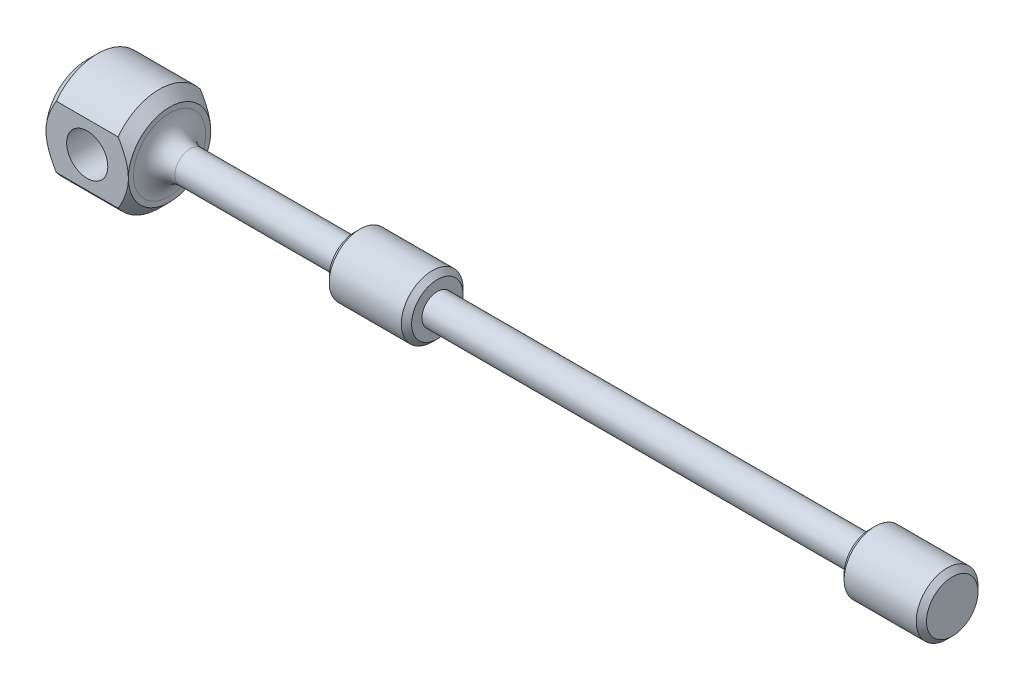
ISO-10303-21;
HEADER;
FILE_DESCRIPTION(('STEP AP214'),'2;1');
FILE_NAME('part.step','',(''),(''),'','','');
FILE_SCHEMA(('AUTOMOTIVE_DESIGN { 1 0 10303 214 1 1 1 1 }'));
ENDSEC;
DATA;
#1=APPLICATION_CONTEXT('core data for automotive mechanical design processes');
#2=APPLICATION_PROTOCOL_DEFINITION('international standard','automotive_design',2000,#1);
#3=PRODUCT_CONTEXT('',#1,'mechanical');
#4=PRODUCT('Part','Part','',(#3));
#5=PRODUCT_RELATED_PRODUCT_CATEGORY('part','',(#4));
#6=PRODUCT_DEFINITION_FORMATION('','',#4);
#7=PRODUCT_DEFINITION_CONTEXT('part definition',#1,'design');
#8=PRODUCT_DEFINITION('design','',#6,#7);
#9=PRODUCT_DEFINITION_SHAPE('','',#8);
#10=(LENGTH_UNIT() NAMED_UNIT(*) SI_UNIT(.MILLI.,.METRE.));
#11=(NAMED_UNIT(*) PLANE_ANGLE_UNIT() SI_UNIT($,.RADIAN.));
#12=(NAMED_UNIT(*) SI_UNIT($,.STERADIAN.) SOLID_ANGLE_UNIT());
#13=UNCERTAINTY_MEASURE_WITH_UNIT(LENGTH_MEASURE(1.E-05),#10,'distance_accuracy_value','');
#14=(GEOMETRIC_REPRESENTATION_CONTEXT(3) GLOBAL_UNCERTAINTY_ASSIGNED_CONTEXT((#13)) GLOBAL_UNIT_ASSIGNED_CONTEXT((#10,
#11,#12)) REPRESENTATION_CONTEXT('',''));
#15=CARTESIAN_POINT('',(0.,0.,0.));
#16=DIRECTION('',(0.,0.,1.));
#17=DIRECTION('',(1.,0.,0.));
#18=AXIS2_PLACEMENT_3D('',#15,#16,#17);
#19=CARTESIAN_POINT('',(-30.,0.,0.));
#20=DIRECTION('',(-1.,0.,0.));
#21=DIRECTION('',(0.,0.,1.));
#22=AXIS2_PLACEMENT_3D('',#19,#20,#21);
#23=CYLINDRICAL_SURFACE('',#22,5.);
#24=DIRECTION('',(-1.,0.,0.));
#25=VECTOR('',#24,1.);
#26=CARTESIAN_POINT('',(-30.,-3.,-4.));
#27=LINE('',#26,#25);
#28=CARTESIAN_POINT('',(-31.,-3.,-4.));
#29=VERTEX_POINT('',#28);
#30=CARTESIAN_POINT('',(-37.,-3.,-4.));
#31=VERTEX_POINT('',#30);
#32=EDGE_CURVE('E195',#29,#31,#27,.T.);
#33=ORIENTED_EDGE('',*,*,#32,.F.);
#34=CARTESIAN_POINT('',(-31.,0.,0.));
#35=DIRECTION('',(-1.,0.,0.));
#36=DIRECTION('',(0.,0.,1.));
#37=AXIS2_PLACEMENT_3D('',#34,#35,#36);
#38=CIRCLE('',#37,5.);
#39=CARTESIAN_POINT('',(-31.,-3.,4.));
#40=VERTEX_POINT('',#39);
#41=EDGE_CURVE('E157',#29,#40,#38,.T.);
#42=ORIENTED_EDGE('',*,*,#41,.T.);
#43=DIRECTION('',(-1.,0.,0.));
#44=VECTOR('',#43,1.);
#45=CARTESIAN_POINT('',(-30.,-3.,4.));
#46=LINE('',#45,#44);
#47=CARTESIAN_POINT('',(-37.,-3.,4.));
#48=VERTEX_POINT('',#47);
#49=EDGE_CURVE('E188',#40,#48,#46,.T.);
#50=ORIENTED_EDGE('',*,*,#49,.T.);
#51=CARTESIAN_POINT('',(-37.,0.,0.));
#52=DIRECTION('',(1.,0.,0.));
#53=DIRECTION('',(0.,0.,-1.));
#54=AXIS2_PLACEMENT_3D('',#51,#52,#53);
#55=CIRCLE('',#54,5.);
#56=EDGE_CURVE('E93',#48,#31,#55,.T.);
#57=ORIENTED_EDGE('',*,*,#56,.T.);
#58=EDGE_LOOP('',(#33,#42,#50,#57));
#59=FACE_BOUND('',#58,.T.);
#60=ADVANCED_FACE('F32',(#59),#23,.T.);
#61=CARTESIAN_POINT('',(38.,0.,0.));
#62=DIRECTION('',(-1.,0.,0.));
#63=DIRECTION('',(0.,0.,1.));
#64=AXIS2_PLACEMENT_3D('',#61,#62,#63);
#65=CYLINDRICAL_SURFACE('',#64,1.5);
#66=CARTESIAN_POINT('',(-28.,0.,0.));
#67=DIRECTION('',(-1.,0.,0.));
#68=DIRECTION('',(0.,0.,1.));
#69=AXIS2_PLACEMENT_3D('',#66,#67,#68);
#70=CIRCLE('',#69,1.5);
#71=CARTESIAN_POINT('',(-28.,0.,1.5));
#72=VERTEX_POINT('',#71);
#73=EDGE_CURVE('E297',#72,#72,#70,.F.);
#74=ORIENTED_EDGE('',*,*,#73,.T.);
#75=EDGE_LOOP('',(#74));
#76=FACE_BOUND('',#75,.T.);
#77=CARTESIAN_POINT('',(-12.,0.,0.));
#78=DIRECTION('',(1.,0.,0.));
#79=DIRECTION('',(0.,0.,-1.));
#80=AXIS2_PLACEMENT_3D('',#77,#78,#79);
#81=CIRCLE('',#80,1.5);
#82=CARTESIAN_POINT('',(-12.,0.,-1.5));
#83=VERTEX_POINT('',#82);
#84=EDGE_CURVE('E206',#83,#83,#81,.T.);
#85=ORIENTED_EDGE('',*,*,#84,.F.);
#86=EDGE_LOOP('',(#85));
#87=FACE_BOUND('',#86,.T.);
#88=ADVANCED_FACE('F262',(#76,#87),#65,.T.);
#89=CARTESIAN_POINT('',(-4.,0.,0.));
#90=DIRECTION('',(1.,0.,0.));
#91=DIRECTION('',(0.,0.,-1.));
#92=AXIS2_PLACEMENT_3D('',#89,#90,#91);
#93=CIRCLE('',#92,1.5);
#94=CARTESIAN_POINT('',(-4.,0.,-1.5));
#95=VERTEX_POINT('',#94);
#96=EDGE_CURVE('E194',#95,#95,#93,.T.);
#97=ORIENTED_EDGE('',*,*,#96,.T.);
#98=EDGE_LOOP('',(#97));
#99=FACE_BOUND('',#98,.T.);
#100=CARTESIAN_POINT('',(38.,0.,0.));
#101=DIRECTION('',(1.,0.,0.));
#102=DIRECTION('',(0.,0.,-1.));
#103=AXIS2_PLACEMENT_3D('',#100,#101,#102);
#104=CIRCLE('',#103,1.5);
#105=CARTESIAN_POINT('',(38.,0.,-1.5));
#106=VERTEX_POINT('',#105);
#107=EDGE_CURVE('E198',#106,#106,#104,.T.);
#108=ORIENTED_EDGE('',*,*,#107,.F.);
#109=EDGE_LOOP('',(#108));
#110=FACE_BOUND('',#109,.T.);
#111=ADVANCED_FACE('F258',(#99,#110),#65,.T.);
#112=CARTESIAN_POINT('',(46.,0.,0.));
#113=DIRECTION('',(-1.,0.,0.));
#114=DIRECTION('',(0.,0.,1.));
#115=AXIS2_PLACEMENT_3D('',#112,#113,#114);
#116=CYLINDRICAL_SURFACE('',#115,3.);
#117=CARTESIAN_POINT('',(38.5,0.,0.));
#118=DIRECTION('',(1.,0.,0.));
#119=DIRECTION('',(0.,0.,-1.));
#120=AXIS2_PLACEMENT_3D('',#117,#118,#119);
#121=CIRCLE('',#120,3.);
#122=CARTESIAN_POINT('',(38.5,0.,-3.));
#123=VERTEX_POINT('',#122);
#124=EDGE_CURVE('E212',#123,#123,#121,.T.);
#125=ORIENTED_EDGE('',*,*,#124,.T.);
#126=EDGE_LOOP('',(#125));
#127=FACE_BOUND('',#126,.T.);
#128=CARTESIAN_POINT('',(45.5,0.,0.));
#129=DIRECTION('',(1.,0.,0.));
#130=DIRECTION('',(0.,0.,-1.));
#131=AXIS2_PLACEMENT_3D('',#128,#129,#130);
#132=CIRCLE('',#131,3.);
#133=CARTESIAN_POINT('',(45.5,0.,-3.));
#134=VERTEX_POINT('',#133);
#135=EDGE_CURVE('E208',#134,#134,#132,.F.);
#136=ORIENTED_EDGE('',*,*,#135,.T.);
#137=EDGE_LOOP('',(#136));
#138=FACE_BOUND('',#137,.T.);
#139=ADVANCED_FACE('F261',(#127,#138),#116,.T.);
#140=CARTESIAN_POINT('',(46.,0.,0.));
#141=DIRECTION('',(1.,0.,0.));
#142=DIRECTION('',(0.,0.,-1.));
#143=AXIS2_PLACEMENT_3D('',#140,#141,#142);
#144=PLANE('',#143);
#145=CARTESIAN_POINT('',(46.,0.,0.));
#146=DIRECTION('',(1.,0.,0.));
#147=DIRECTION('',(0.,0.,-1.));
#148=AXIS2_PLACEMENT_3D('',#145,#146,#147);
#149=CIRCLE('',#148,2.50000000000002);
#150=CARTESIAN_POINT('',(46.,0.,-2.50000000000002));
#151=VERTEX_POINT('',#150);
#152=EDGE_CURVE('E218',#151,#151,#149,.T.);
#153=ORIENTED_EDGE('',*,*,#152,.T.);
#154=EDGE_LOOP('',(#153));
#155=FACE_BOUND('',#154,.T.);
#156=ADVANCED_FACE('F267',(#155),#144,.T.);
#157=CARTESIAN_POINT('',(38.,0.,0.));
#158=DIRECTION('',(1.,0.,0.));
#159=DIRECTION('',(0.,0.,-1.));
#160=AXIS2_PLACEMENT_3D('',#157,#158,#159);
#161=PLANE('',#160);
#162=CARTESIAN_POINT('',(38.,0.,0.));
#163=DIRECTION('',(1.,0.,0.));
#164=DIRECTION('',(0.,0.,-1.));
#165=AXIS2_PLACEMENT_3D('',#162,#163,#164);
#166=CIRCLE('',#165,2.50000000000002);
#167=CARTESIAN_POINT('',(38.,0.,-2.50000000000002));
#168=VERTEX_POINT('',#167);
#169=EDGE_CURVE('E215',#168,#168,#166,.F.);
#170=ORIENTED_EDGE('',*,*,#169,.T.);
#171=EDGE_LOOP('',(#170));
#172=FACE_BOUND('',#171,.T.);
#173=ORIENTED_EDGE('',*,*,#107,.T.);
#174=EDGE_LOOP('',(#173));
#175=FACE_BOUND('',#174,.T.);
#176=ADVANCED_FACE('F244',(#172,#175),#161,.F.);
#177=CARTESIAN_POINT('',(-4.,0.,0.));
#178=DIRECTION('',(-1.,0.,0.));
#179=DIRECTION('',(0.,0.,1.));
#180=AXIS2_PLACEMENT_3D('',#177,#178,#179);
#181=CYLINDRICAL_SURFACE('',#180,3.);
#182=CARTESIAN_POINT('',(-11.5,0.,0.));
#183=DIRECTION('',(1.,0.,0.));
#184=DIRECTION('',(0.,0.,-1.));
#185=AXIS2_PLACEMENT_3D('',#182,#183,#184);
#186=CIRCLE('',#185,3.);
#187=CARTESIAN_POINT('',(-11.5,0.,-3.));
#188=VERTEX_POINT('',#187);
#189=EDGE_CURVE('E224',#188,#188,#186,.T.);
#190=ORIENTED_EDGE('',*,*,#189,.T.);
#191=EDGE_LOOP('',(#190));
#192=FACE_BOUND('',#191,.T.);
#193=CARTESIAN_POINT('',(-4.49999999999999,0.,0.));
#194=DIRECTION('',(1.,0.,0.));
#195=DIRECTION('',(0.,0.,-1.));
#196=AXIS2_PLACEMENT_3D('',#193,#194,#195);
#197=CIRCLE('',#196,3.);
#198=CARTESIAN_POINT('',(-4.49999999999999,0.,-3.));
#199=VERTEX_POINT('',#198);
#200=EDGE_CURVE('E221',#199,#199,#197,.F.);
#201=ORIENTED_EDGE('',*,*,#200,.T.);
#202=EDGE_LOOP('',(#201));
#203=FACE_BOUND('',#202,.T.);
#204=ADVANCED_FACE('F240',(#192,#203),#181,.T.);
#205=CARTESIAN_POINT('',(-4.,0.,0.));
#206=DIRECTION('',(1.,0.,0.));
#207=DIRECTION('',(0.,0.,-1.));
#208=AXIS2_PLACEMENT_3D('',#205,#206,#207);
#209=PLANE('',#208);
#210=CARTESIAN_POINT('',(-4.,0.,0.));
#211=DIRECTION('',(1.,0.,0.));
#212=DIRECTION('',(0.,0.,-1.));
#213=AXIS2_PLACEMENT_3D('',#210,#211,#212);
#214=CIRCLE('',#213,2.50000000000002);
#215=CARTESIAN_POINT('',(-4.,0.,-2.50000000000002));
#216=VERTEX_POINT('',#215);
#217=EDGE_CURVE('E116',#216,#216,#214,.T.);
#218=ORIENTED_EDGE('',*,*,#217,.T.);
#219=EDGE_LOOP('',(#218));
#220=FACE_BOUND('',#219,.T.);
#221=ORIENTED_EDGE('',*,*,#96,.F.);
#222=EDGE_LOOP('',(#221));
#223=FACE_BOUND('',#222,.T.);
#224=ADVANCED_FACE('F243',(#220,#223),#209,.T.);
#225=CARTESIAN_POINT('',(-12.,0.,0.));
#226=DIRECTION('',(1.,0.,0.));
#227=DIRECTION('',(0.,0.,-1.));
#228=AXIS2_PLACEMENT_3D('',#225,#226,#227);
#229=PLANE('',#228);
#230=CARTESIAN_POINT('',(-12.,0.,0.));
#231=DIRECTION('',(1.,0.,0.));
#232=DIRECTION('',(0.,0.,-1.));
#233=AXIS2_PLACEMENT_3D('',#230,#231,#232);
#234=CIRCLE('',#233,2.5);
#235=CARTESIAN_POINT('',(-12.,0.,-2.5));
#236=VERTEX_POINT('',#235);
#237=EDGE_CURVE('E119',#236,#236,#234,.F.);
#238=ORIENTED_EDGE('',*,*,#237,.T.);
#239=EDGE_LOOP('',(#238));
#240=FACE_BOUND('',#239,.T.);
#241=ORIENTED_EDGE('',*,*,#84,.T.);
#242=EDGE_LOOP('',(#241));
#243=FACE_BOUND('',#242,.T.);
#244=ADVANCED_FACE('F229',(#240,#243),#229,.F.);
#245=CARTESIAN_POINT('',(38.5,0.,0.));
#246=DIRECTION('',(1.,0.,0.));
#247=DIRECTION('',(0.,0.,-1.));
#248=AXIS2_PLACEMENT_3D('',#245,#246,#247);
#249=CONICAL_SURFACE('',#248,3.,0.785398163397446);
#250=ORIENTED_EDGE('',*,*,#169,.F.);
#251=EDGE_LOOP('',(#250));
#252=FACE_BOUND('',#251,.T.);
#253=ORIENTED_EDGE('',*,*,#124,.F.);
#254=EDGE_LOOP('',(#253));
#255=FACE_BOUND('',#254,.T.);
#256=ADVANCED_FACE('F319',(#252,#255),#249,.T.);
#257=CARTESIAN_POINT('',(46.,0.,0.));
#258=DIRECTION('',(-1.,0.,0.));
#259=DIRECTION('',(0.,0.,1.));
#260=AXIS2_PLACEMENT_3D('',#257,#258,#259);
#261=CONICAL_SURFACE('',#260,2.50000000000002,0.785398163397439);
#262=ORIENTED_EDGE('',*,*,#135,.F.);
#263=EDGE_LOOP('',(#262));
#264=FACE_BOUND('',#263,.T.);
#265=ORIENTED_EDGE('',*,*,#152,.F.);
#266=EDGE_LOOP('',(#265));
#267=FACE_BOUND('',#266,.T.);
#268=ADVANCED_FACE('F236',(#264,#267),#261,.T.);
#269=CARTESIAN_POINT('',(-11.5,0.,0.));
#270=DIRECTION('',(1.,0.,0.));
#271=DIRECTION('',(0.,0.,-1.));
#272=AXIS2_PLACEMENT_3D('',#269,#270,#271);
#273=CONICAL_SURFACE('',#272,3.,0.785398163397453);
#274=ORIENTED_EDGE('',*,*,#237,.F.);
#275=EDGE_LOOP('',(#274));
#276=FACE_BOUND('',#275,.T.);
#277=ORIENTED_EDGE('',*,*,#189,.F.);
#278=EDGE_LOOP('',(#277));
#279=FACE_BOUND('',#278,.T.);
#280=ADVANCED_FACE('F232',(#276,#279),#273,.T.);
#281=CARTESIAN_POINT('',(-4.,0.,0.));
#282=DIRECTION('',(-1.,0.,0.));
#283=DIRECTION('',(0.,0.,1.));
#284=AXIS2_PLACEMENT_3D('',#281,#282,#283);
#285=CONICAL_SURFACE('',#284,2.50000000000002,0.785398163397438);
#286=ORIENTED_EDGE('',*,*,#200,.F.);
#287=EDGE_LOOP('',(#286));
#288=FACE_BOUND('',#287,.T.);
#289=ORIENTED_EDGE('',*,*,#217,.F.);
#290=EDGE_LOOP('',(#289));
#291=FACE_BOUND('',#290,.T.);
#292=ADVANCED_FACE('F235',(#288,#291),#285,.T.);
#293=DIRECTION('',(-1.,0.,0.));
#294=VECTOR('',#293,1.);
#295=CARTESIAN_POINT('',(-30.,3.,4.));
#296=LINE('',#295,#294);
#297=CARTESIAN_POINT('',(-31.,3.,4.));
#298=VERTEX_POINT('',#297);
#299=CARTESIAN_POINT('',(-37.,3.,4.));
#300=VERTEX_POINT('',#299);
#301=EDGE_CURVE('E101',#298,#300,#296,.T.);
#302=ORIENTED_EDGE('',*,*,#301,.F.);
#303=CARTESIAN_POINT('',(-31.,0.,0.));
#304=DIRECTION('',(-1.,0.,0.));
#305=DIRECTION('',(0.,0.,1.));
#306=AXIS2_PLACEMENT_3D('',#303,#304,#305);
#307=CIRCLE('',#306,5.);
#308=CARTESIAN_POINT('',(-31.,3.,-4.));
#309=VERTEX_POINT('',#308);
#310=EDGE_CURVE('E11',#298,#309,#307,.T.);
#311=ORIENTED_EDGE('',*,*,#310,.T.);
#312=DIRECTION('',(-1.,0.,0.));
#313=VECTOR('',#312,1.);
#314=CARTESIAN_POINT('',(-30.,3.,-4.));
#315=LINE('',#314,#313);
#316=CARTESIAN_POINT('',(-37.,3.,-4.));
#317=VERTEX_POINT('',#316);
#318=EDGE_CURVE('E193',#309,#317,#315,.T.);
#319=ORIENTED_EDGE('',*,*,#318,.T.);
#320=CARTESIAN_POINT('',(-37.,0.,0.));
#321=DIRECTION('',(1.,0.,0.));
#322=DIRECTION('',(0.,0.,-1.));
#323=AXIS2_PLACEMENT_3D('',#320,#321,#322);
#324=CIRCLE('',#323,5.);
#325=EDGE_CURVE('E298',#317,#300,#324,.T.);
#326=ORIENTED_EDGE('',*,*,#325,.T.);
#327=EDGE_LOOP('',(#302,#311,#319,#326));
#328=FACE_BOUND('',#327,.T.);
#329=ADVANCED_FACE('F192',(#328),#23,.T.);
#330=CARTESIAN_POINT('',(-30.,0.,0.));
#331=DIRECTION('',(-1.,0.,0.));
#332=DIRECTION('',(0.,0.,1.));
#333=AXIS2_PLACEMENT_3D('',#330,#331,#332);
#334=PLANE('',#333);
#335=CARTESIAN_POINT('',(-30.,0.,0.));
#336=DIRECTION('',(-1.,0.,0.));
#337=DIRECTION('',(0.,0.,1.));
#338=AXIS2_PLACEMENT_3D('',#335,#336,#337);
#339=CIRCLE('',#338,3.5);
#340=CARTESIAN_POINT('',(-30.,0.,3.5));
#341=VERTEX_POINT('',#340);
#342=EDGE_CURVE('E295',#341,#341,#339,.T.);
#343=ORIENTED_EDGE('',*,*,#342,.T.);
#344=EDGE_LOOP('',(#343));
#345=FACE_BOUND('',#344,.T.);
#346=CARTESIAN_POINT('',(-30.,0.,0.));
#347=DIRECTION('',(-1.,0.,0.));
#348=DIRECTION('',(0.,0.,1.));
#349=AXIS2_PLACEMENT_3D('',#346,#347,#348);
#350=CIRCLE('',#349,3.99999999999999);
#351=CARTESIAN_POINT('',(-30.,0.,-4.));
#352=VERTEX_POINT('',#351);
#353=CARTESIAN_POINT('',(-30.,0.,4.));
#354=VERTEX_POINT('',#353);
#355=EDGE_CURVE('E165',#352,#354,#350,.F.);
#356=ORIENTED_EDGE('',*,*,#355,.T.);
#357=CARTESIAN_POINT('',(-30.,0.,0.));
#358=DIRECTION('',(-1.,0.,0.));
#359=DIRECTION('',(0.,0.,1.));
#360=AXIS2_PLACEMENT_3D('',#357,#358,#359);
#361=CIRCLE('',#360,3.99999999999999);
#362=EDGE_CURVE('E182',#354,#352,#361,.F.);
#363=ORIENTED_EDGE('',*,*,#362,.T.);
#364=EDGE_LOOP('',(#356,#363));
#365=FACE_BOUND('',#364,.T.);
#366=ADVANCED_FACE('F186',(#345,#365),#334,.F.);
#367=CARTESIAN_POINT('',(-38.,0.,0.));
#368=DIRECTION('',(1.,0.,0.));
#369=DIRECTION('',(0.,0.,-1.));
#370=AXIS2_PLACEMENT_3D('',#367,#368,#369);
#371=PLANE('',#370);
#372=CARTESIAN_POINT('',(-38.,0.,0.));
#373=DIRECTION('',(1.,0.,0.));
#374=DIRECTION('',(0.,0.,-1.));
#375=AXIS2_PLACEMENT_3D('',#372,#373,#374);
#376=CIRCLE('',#375,4.);
#377=CARTESIAN_POINT('',(-38.,0.,4.));
#378=VERTEX_POINT('',#377);
#379=CARTESIAN_POINT('',(-38.,0.,-4.));
#380=VERTEX_POINT('',#379);
#381=EDGE_CURVE('E110',#378,#380,#376,.F.);
#382=ORIENTED_EDGE('',*,*,#381,.T.);
#383=CARTESIAN_POINT('',(-38.,0.,0.));
#384=DIRECTION('',(1.,0.,0.));
#385=DIRECTION('',(0.,0.,-1.));
#386=AXIS2_PLACEMENT_3D('',#383,#384,#385);
#387=CIRCLE('',#386,4.);
#388=EDGE_CURVE('E91',#380,#378,#387,.F.);
#389=ORIENTED_EDGE('',*,*,#388,.T.);
#390=EDGE_LOOP('',(#382,#389));
#391=FACE_BOUND('',#390,.T.);
#392=ADVANCED_FACE('F109',(#391),#371,.F.);
#393=CARTESIAN_POINT('',(-30.,3.,-4.));
#394=DIRECTION('',(0.,0.,1.));
#395=DIRECTION('',(1.,0.,0.));
#396=AXIS2_PLACEMENT_3D('',#393,#394,#395);
#397=PLANE('',#396);
#398=CARTESIAN_POINT('',(-34.,0.,-4.));
#399=DIRECTION('',(0.,0.,1.));
#400=DIRECTION('',(1.,0.,0.));
#401=AXIS2_PLACEMENT_3D('',#398,#399,#400);
#402=CIRCLE('',#401,2.);
#403=CARTESIAN_POINT('',(-32.,0.,-4.));
#404=VERTEX_POINT('',#403);
#405=EDGE_CURVE('E474',#404,#404,#402,.T.);
#406=ORIENTED_EDGE('',*,*,#405,.T.);
#407=EDGE_LOOP('',(#406));
#408=FACE_BOUND('',#407,.T.);
#409=CARTESIAN_POINT('',(-31.,3.,-4.));
#410=CARTESIAN_POINT('',(-30.956581405577,2.92762836200348,-4.));
#411=CARTESIAN_POINT('',(-30.9138959485449,2.85481802742838,-4.));
#412=CARTESIAN_POINT('',(-30.83019894129,2.70821938275152,-4.));
#413=CARTESIAN_POINT('',(-30.7891877950874,2.63443084222755,-4.));
#414=CARTESIAN_POINT('',(-30.6687412261486,2.41100406792378,-4.));
#415=CARTESIAN_POINT('',(-30.5921850767644,2.25978602411566,-4.));
#416=CARTESIAN_POINT('',(-30.450923903765,1.95659067359725,-4.));
#417=CARTESIAN_POINT('',(-30.3859648909348,1.80473273623762,-4.));
#418=CARTESIAN_POINT('',(-30.2683839947351,1.49644202508002,-4.));
#419=CARTESIAN_POINT('',(-30.2157450905884,1.34001590275356,-4.));
#420=CARTESIAN_POINT('',(-30.1438275437783,1.08612110951737,-4.));
#421=CARTESIAN_POINT('',(-30.1196197271478,0.990042302625609,-4.));
#422=CARTESIAN_POINT('',(-30.0774412059882,0.796520862813753,-4.));
#423=CARTESIAN_POINT('',(-30.0594697158391,0.69907840328964,-4.));
#424=CARTESIAN_POINT('',(-30.0301457323276,0.501704347689392,-4.));
#425=CARTESIAN_POINT('',(-30.0188959865408,0.401757304518321,-4.));
#426=CARTESIAN_POINT('',(-30.0037953128905,0.201215242114617,-4.));
#427=CARTESIAN_POINT('',(-29.999951356772,0.10061970166896,-4.));
#428=CARTESIAN_POINT('',(-30.,0.,-4.));
#429=B_SPLINE_CURVE_WITH_KNOTS('',3,(#409,#410,#411,#412,#413,#414,#415,#416,#417,#418,#419,
#420,#421,#422,#423,#424,#425,#426,#427,#428),.UNSPECIFIED.,.F.,.F.,(4,2,2,2,2,2,2,2,2,4),(0.,
0.25318137158952,0.506423480383857,1.01459556294124,1.50970891621842,2.00413415664269,
2.30120350256042,2.5982354116286,2.89969868702638,3.20144561888665),.UNSPECIFIED.);
#430=EDGE_CURVE('E48',#309,#352,#429,.T.);
#431=ORIENTED_EDGE('',*,*,#430,.T.);
#432=CARTESIAN_POINT('',(-30.,0.,-3.99999999999999));
#433=CARTESIAN_POINT('',(-29.999995048581,-0.0614896821712425,-4.));
#434=CARTESIAN_POINT('',(-30.0014185758096,-0.122970237034906,-4.));
#435=CARTESIAN_POINT('',(-30.0070760257621,-0.245792268954902,-4.));
#436=CARTESIAN_POINT('',(-30.0113094947052,-0.307133766863008,-4.));
#437=CARTESIAN_POINT('',(-30.0281318667511,-0.490538519574095,-4.));
#438=CARTESIAN_POINT('',(-30.0448431319862,-0.612243847557195,-4.));
#439=CARTESIAN_POINT('',(-30.0880127467618,-0.851773849884564,-4.));
#440=CARTESIAN_POINT('',(-30.1143041589317,-0.969629397394428,-4.));
#441=CARTESIAN_POINT('',(-30.1754966667891,-1.20311028898421,-4.));
#442=CARTESIAN_POINT('',(-30.210401313596,-1.31873469194053,-4.));
#443=CARTESIAN_POINT('',(-30.2948602113957,-1.56915278958547,-4.));
#444=CARTESIAN_POINT('',(-30.3459370048148,-1.70342909226877,-4.));
#445=CARTESIAN_POINT('',(-30.4565094208477,-1.96849997837182,-4.));
#446=CARTESIAN_POINT('',(-30.516009141589,-2.09929282991421,-4.));
#447=CARTESIAN_POINT('',(-30.6430430444663,-2.36033095148102,-4.));
#448=CARTESIAN_POINT('',(-30.7107211665127,-2.49050544053603,-4.));
#449=CARTESIAN_POINT('',(-30.8515677946968,-2.74756392847844,-4.));
#450=CARTESIAN_POINT('',(-30.9247264560827,-2.87445330157051,-4.));
#451=CARTESIAN_POINT('',(-31.,-3.,-4.));
#452=B_SPLINE_CURVE_WITH_KNOTS('',3,(#432,#433,#434,#435,#436,#437,#438,#439,#440,#441,#442,
#443,#444,#445,#446,#447,#448,#449,#450,#451),.UNSPECIFIED.,.F.,.F.,(4,2,2,2,2,2,2,2,2,4),(0.,
0.184435127504877,0.368840477618775,0.736868694951198,1.09876868246571,1.4608181264469,
1.89144466887991,2.32228145495382,2.76227942763343,3.20150515183776),.UNSPECIFIED.);
#453=EDGE_CURVE('E41',#352,#29,#452,.T.);
#454=ORIENTED_EDGE('',*,*,#453,.T.);
#455=ORIENTED_EDGE('',*,*,#32,.T.);
#456=CARTESIAN_POINT('',(-37.,-3.,-4.));
#457=CARTESIAN_POINT('',(-37.043418594423,-2.92762836200348,-4.));
#458=CARTESIAN_POINT('',(-37.0861040514551,-2.85481802742838,-4.));
#459=CARTESIAN_POINT('',(-37.16980105871,-2.70821938275152,-4.));
#460=CARTESIAN_POINT('',(-37.2108122049126,-2.63443084222755,-4.));
#461=CARTESIAN_POINT('',(-37.3312587738514,-2.41100406792379,-4.));
#462=CARTESIAN_POINT('',(-37.4078149232356,-2.25978602411566,-4.));
#463=CARTESIAN_POINT('',(-37.549076096235,-1.95659067359725,-4.));
#464=CARTESIAN_POINT('',(-37.6140351090652,-1.80473273623763,-4.));
#465=CARTESIAN_POINT('',(-37.7316160052649,-1.49644202508002,-4.));
#466=CARTESIAN_POINT('',(-37.7842549094116,-1.34001590275357,-4.));
#467=CARTESIAN_POINT('',(-37.8561724562217,-1.08612110951738,-4.));
#468=CARTESIAN_POINT('',(-37.8803802728522,-0.990042302625617,-4.));
#469=CARTESIAN_POINT('',(-37.9225587940118,-0.79652086281376,-4.));
#470=CARTESIAN_POINT('',(-37.9405302841609,-0.699078403289646,-4.));
#471=CARTESIAN_POINT('',(-37.9698542676724,-0.501704347689397,-4.));
#472=CARTESIAN_POINT('',(-37.9811040134592,-0.401757304518325,-4.));
#473=CARTESIAN_POINT('',(-37.9962046871095,-0.20121524211462,-4.));
#474=CARTESIAN_POINT('',(-38.000048643228,-0.100619701668962,-4.));
#475=CARTESIAN_POINT('',(-38.,0.,-4.));
#476=B_SPLINE_CURVE_WITH_KNOTS('',3,(#456,#457,#458,#459,#460,#461,#462,#463,#464,#465,#466,
#467,#468,#469,#470,#471,#472,#473,#474,#475),.UNSPECIFIED.,.F.,.F.,(4,2,2,2,2,2,2,2,2,4),(0.,
0.253181371589518,0.506423480383854,1.01459556294123,1.50970891621841,2.00413415664269,
2.30120350256042,2.5982354116286,2.89969868702638,3.20144561888666),.UNSPECIFIED.);
#477=EDGE_CURVE('E301',#31,#380,#476,.T.);
#478=ORIENTED_EDGE('',*,*,#477,.T.);
#479=CARTESIAN_POINT('',(-38.,0.,-4.));
#480=CARTESIAN_POINT('',(-38.000004951419,0.0614896821712422,-4.));
#481=CARTESIAN_POINT('',(-37.9985814241904,0.122970237034906,-4.));
#482=CARTESIAN_POINT('',(-37.9929239742379,0.245792268954901,-4.));
#483=CARTESIAN_POINT('',(-37.9886905052948,0.307133766863006,-4.));
#484=CARTESIAN_POINT('',(-37.9718681332489,0.490538519574092,-4.));
#485=CARTESIAN_POINT('',(-37.9551568680138,0.612243847557191,-4.));
#486=CARTESIAN_POINT('',(-37.9119872532382,0.851773849884559,-4.));
#487=CARTESIAN_POINT('',(-37.8856958410683,0.969629397394422,-4.));
#488=CARTESIAN_POINT('',(-37.824503333211,1.2031102889842,-4.));
#489=CARTESIAN_POINT('',(-37.789598686404,1.31873469194052,-4.));
#490=CARTESIAN_POINT('',(-37.7051397886043,1.56915278958546,-4.));
#491=CARTESIAN_POINT('',(-37.6540629951852,1.70342909226877,-4.));
#492=CARTESIAN_POINT('',(-37.5434905791523,1.96849997837181,-4.));
#493=CARTESIAN_POINT('',(-37.483990858411,2.09929282991421,-4.));
#494=CARTESIAN_POINT('',(-37.3569569555337,2.36033095148102,-4.));
#495=CARTESIAN_POINT('',(-37.2892788334873,2.49050544053603,-4.));
#496=CARTESIAN_POINT('',(-37.1484322053032,2.74756392847845,-4.));
#497=CARTESIAN_POINT('',(-37.0752735439173,2.87445330157051,-4.));
#498=CARTESIAN_POINT('',(-37.,3.,-4.));
#499=B_SPLINE_CURVE_WITH_KNOTS('',3,(#479,#480,#481,#482,#483,#484,#485,#486,#487,#488,#489,
#490,#491,#492,#493,#494,#495,#496,#497,#498),.UNSPECIFIED.,.F.,.F.,(4,2,2,2,2,2,2,2,2,4),(0.,
0.184435127504876,0.368840477618773,0.736868694951194,1.0987686824657,1.46081812644689,
1.89144466887991,2.32228145495382,2.76227942763344,3.20150515183777),.UNSPECIFIED.);
#500=EDGE_CURVE('E114',#380,#317,#499,.T.);
#501=ORIENTED_EDGE('',*,*,#500,.T.);
#502=ORIENTED_EDGE('',*,*,#318,.F.);
#503=EDGE_LOOP('',(#431,#454,#455,#478,#501,#502));
#504=FACE_BOUND('',#503,.T.);
#505=ADVANCED_FACE('F141',(#408,#504),#397,.F.);
#506=CARTESIAN_POINT('',(-30.,3.,4.));
#507=DIRECTION('',(0.,0.,-1.));
#508=DIRECTION('',(-1.,0.,0.));
#509=AXIS2_PLACEMENT_3D('',#506,#507,#508);
#510=PLANE('',#509);
#511=CARTESIAN_POINT('',(-34.,0.,4.));
#512=DIRECTION('',(0.,0.,1.));
#513=DIRECTION('',(1.,0.,0.));
#514=AXIS2_PLACEMENT_3D('',#511,#512,#513);
#515=CIRCLE('',#514,2.);
#516=CARTESIAN_POINT('',(-32.,0.,4.));
#517=VERTEX_POINT('',#516);
#518=EDGE_CURVE('E475',#517,#517,#515,.T.);
#519=ORIENTED_EDGE('',*,*,#518,.F.);
#520=EDGE_LOOP('',(#519));
#521=FACE_BOUND('',#520,.T.);
#522=ORIENTED_EDGE('',*,*,#49,.F.);
#523=CARTESIAN_POINT('',(-31.,-3.,4.));
#524=CARTESIAN_POINT('',(-30.956581405577,-2.92762836200348,4.));
#525=CARTESIAN_POINT('',(-30.9138959485449,-2.85481802742838,4.));
#526=CARTESIAN_POINT('',(-30.83019894129,-2.70821938275152,4.));
#527=CARTESIAN_POINT('',(-30.7891877950874,-2.63443084222755,4.));
#528=CARTESIAN_POINT('',(-30.6687412261486,-2.41100406792378,4.));
#529=CARTESIAN_POINT('',(-30.5921850767644,-2.25978602411566,4.));
#530=CARTESIAN_POINT('',(-30.450923903765,-1.95659067359725,4.));
#531=CARTESIAN_POINT('',(-30.3859648909348,-1.80473273623762,4.));
#532=CARTESIAN_POINT('',(-30.2683839947351,-1.49644202508001,4.));
#533=CARTESIAN_POINT('',(-30.2157450905884,-1.34001590275356,4.));
#534=CARTESIAN_POINT('',(-30.1438275437783,-1.08612110951737,4.));
#535=CARTESIAN_POINT('',(-30.1196197271478,-0.990042302625609,4.));
#536=CARTESIAN_POINT('',(-30.0774412059882,-0.796520862813753,4.));
#537=CARTESIAN_POINT('',(-30.0594697158391,-0.69907840328964,4.));
#538=CARTESIAN_POINT('',(-30.0301457323276,-0.501704347689392,4.));
#539=CARTESIAN_POINT('',(-30.0188959865408,-0.401757304518321,4.));
#540=CARTESIAN_POINT('',(-30.0037953128905,-0.201215242114617,4.));
#541=CARTESIAN_POINT('',(-29.999951356772,-0.10061970166896,4.));
#542=CARTESIAN_POINT('',(-30.,0.,4.));
#543=B_SPLINE_CURVE_WITH_KNOTS('',3,(#523,#524,#525,#526,#527,#528,#529,#530,#531,#532,#533,
#534,#535,#536,#537,#538,#539,#540,#541,#542),.UNSPECIFIED.,.F.,.F.,(4,2,2,2,2,2,2,2,2,4),(0.,
0.253181371589521,0.506423480383856,1.01459556294124,1.50970891621842,2.00413415664269,
2.30120350256042,2.5982354116286,2.89969868702638,3.20144561888665),.UNSPECIFIED.);
#544=EDGE_CURVE('E156',#40,#354,#543,.T.);
#545=ORIENTED_EDGE('',*,*,#544,.T.);
#546=CARTESIAN_POINT('',(-30.,0.,3.99999999999999));
#547=CARTESIAN_POINT('',(-29.999995048581,0.0614896821712426,4.));
#548=CARTESIAN_POINT('',(-30.0014185758096,0.122970237034906,4.));
#549=CARTESIAN_POINT('',(-30.0070760257621,0.245792268954902,4.));
#550=CARTESIAN_POINT('',(-30.0113094947052,0.307133766863008,4.));
#551=CARTESIAN_POINT('',(-30.0281318667511,0.490538519574094,4.));
#552=CARTESIAN_POINT('',(-30.0448431319862,0.612243847557195,4.));
#553=CARTESIAN_POINT('',(-30.0880127467618,0.851773849884563,4.));
#554=CARTESIAN_POINT('',(-30.1143041589317,0.969629397394427,4.));
#555=CARTESIAN_POINT('',(-30.1754966667891,1.20311028898421,4.));
#556=CARTESIAN_POINT('',(-30.210401313596,1.31873469194053,4.));
#557=CARTESIAN_POINT('',(-30.2948602113957,1.56915278958547,4.));
#558=CARTESIAN_POINT('',(-30.3459370048148,1.70342909226877,4.));
#559=CARTESIAN_POINT('',(-30.4565094208477,1.96849997837182,4.));
#560=CARTESIAN_POINT('',(-30.516009141589,2.09929282991421,4.));
#561=CARTESIAN_POINT('',(-30.6430430444663,2.36033095148102,4.));
#562=CARTESIAN_POINT('',(-30.7107211665127,2.49050544053603,4.));
#563=CARTESIAN_POINT('',(-30.8515677946968,2.74756392847844,4.));
#564=CARTESIAN_POINT('',(-30.9247264560827,2.87445330157051,4.));
#565=CARTESIAN_POINT('',(-31.,3.,4.));
#566=B_SPLINE_CURVE_WITH_KNOTS('',3,(#546,#547,#548,#549,#550,#551,#552,#553,#554,#555,#556,
#557,#558,#559,#560,#561,#562,#563,#564,#565),.UNSPECIFIED.,.F.,.F.,(4,2,2,2,2,2,2,2,2,4),(0.,
0.184435127504876,0.368840477618774,0.736868694951198,1.09876868246571,1.4608181264469,
1.89144466887991,2.32228145495382,2.76227942763344,3.20150515183776),.UNSPECIFIED.);
#567=EDGE_CURVE('E150',#354,#298,#566,.T.);
#568=ORIENTED_EDGE('',*,*,#567,.T.);
#569=ORIENTED_EDGE('',*,*,#301,.T.);
#570=CARTESIAN_POINT('',(-37.,3.,4.));
#571=CARTESIAN_POINT('',(-37.043418594423,2.92762836200348,4.));
#572=CARTESIAN_POINT('',(-37.0861040514551,2.85481802742838,4.));
#573=CARTESIAN_POINT('',(-37.16980105871,2.70821938275152,4.));
#574=CARTESIAN_POINT('',(-37.2108122049126,2.63443084222755,4.));
#575=CARTESIAN_POINT('',(-37.3312587738514,2.41100406792379,4.));
#576=CARTESIAN_POINT('',(-37.4078149232356,2.25978602411567,4.));
#577=CARTESIAN_POINT('',(-37.549076096235,1.95659067359726,4.));
#578=CARTESIAN_POINT('',(-37.6140351090652,1.80473273623763,4.));
#579=CARTESIAN_POINT('',(-37.7316160052649,1.49644202508003,4.));
#580=CARTESIAN_POINT('',(-37.7842549094116,1.34001590275357,4.));
#581=CARTESIAN_POINT('',(-37.8561724562217,1.08612110951738,4.));
#582=CARTESIAN_POINT('',(-37.8803802728522,0.990042302625619,4.));
#583=CARTESIAN_POINT('',(-37.9225587940118,0.796520862813761,4.));
#584=CARTESIAN_POINT('',(-37.9405302841609,0.699078403289647,4.));
#585=CARTESIAN_POINT('',(-37.9698542676724,0.501704347689398,4.));
#586=CARTESIAN_POINT('',(-37.9811040134592,0.401757304518326,4.));
#587=CARTESIAN_POINT('',(-37.9962046871095,0.201215242114621,4.));
#588=CARTESIAN_POINT('',(-38.000048643228,0.100619701668963,4.));
#589=CARTESIAN_POINT('',(-38.,0.,4.));
#590=B_SPLINE_CURVE_WITH_KNOTS('',3,(#570,#571,#572,#573,#574,#575,#576,#577,#578,#579,#580,
#581,#582,#583,#584,#585,#586,#587,#588,#589),.UNSPECIFIED.,.F.,.F.,(4,2,2,2,2,2,2,2,2,4),(0.,
0.253181371589517,0.506423480383852,1.01459556294123,1.50970891621841,2.00413415664269,
2.30120350256042,2.5982354116286,2.89969868702638,3.20144561888666),.UNSPECIFIED.);
#591=EDGE_CURVE('E96',#300,#378,#590,.T.);
#592=ORIENTED_EDGE('',*,*,#591,.T.);
#593=CARTESIAN_POINT('',(-38.,0.,4.));
#594=CARTESIAN_POINT('',(-38.000004951419,-0.0614896821712421,4.));
#595=CARTESIAN_POINT('',(-37.9985814241904,-0.122970237034905,4.));
#596=CARTESIAN_POINT('',(-37.9929239742379,-0.245792268954901,4.));
#597=CARTESIAN_POINT('',(-37.9886905052948,-0.307133766863006,4.));
#598=CARTESIAN_POINT('',(-37.9718681332489,-0.490538519574092,4.));
#599=CARTESIAN_POINT('',(-37.9551568680138,-0.612243847557192,4.));
#600=CARTESIAN_POINT('',(-37.9119872532382,-0.851773849884559,4.));
#601=CARTESIAN_POINT('',(-37.8856958410683,-0.969629397394422,4.));
#602=CARTESIAN_POINT('',(-37.824503333211,-1.2031102889842,4.));
#603=CARTESIAN_POINT('',(-37.789598686404,-1.31873469194052,4.));
#604=CARTESIAN_POINT('',(-37.7051397886043,-1.56915278958546,4.));
#605=CARTESIAN_POINT('',(-37.6540629951852,-1.70342909226876,4.));
#606=CARTESIAN_POINT('',(-37.5434905791523,-1.96849997837181,4.));
#607=CARTESIAN_POINT('',(-37.483990858411,-2.09929282991421,4.));
#608=CARTESIAN_POINT('',(-37.3569569555337,-2.36033095148102,4.));
#609=CARTESIAN_POINT('',(-37.2892788334873,-2.49050544053602,4.));
#610=CARTESIAN_POINT('',(-37.1484322053032,-2.74756392847844,4.));
#611=CARTESIAN_POINT('',(-37.0752735439173,-2.87445330157051,4.));
#612=CARTESIAN_POINT('',(-37.,-3.,4.));
#613=B_SPLINE_CURVE_WITH_KNOTS('',3,(#593,#594,#595,#596,#597,#598,#599,#600,#601,#602,#603,
#604,#605,#606,#607,#608,#609,#610,#611,#612),.UNSPECIFIED.,.F.,.F.,(4,2,2,2,2,2,2,2,2,4),(0.,
0.184435127504876,0.368840477618772,0.736868694951194,1.0987686824657,1.46081812644689,
1.8914446688799,2.32228145495382,2.76227942763343,3.20150515183776),.UNSPECIFIED.);
#614=EDGE_CURVE('E86',#378,#48,#613,.T.);
#615=ORIENTED_EDGE('',*,*,#614,.T.);
#616=EDGE_LOOP('',(#522,#545,#568,#569,#592,#615));
#617=FACE_BOUND('',#616,.T.);
#618=ADVANCED_FACE('F99',(#521,#617),#510,.F.);
#619=CARTESIAN_POINT('',(-34.,0.,-4.));
#620=DIRECTION('',(0.,0.,1.));
#621=DIRECTION('',(1.,0.,0.));
#622=AXIS2_PLACEMENT_3D('',#619,#620,#621);
#623=CYLINDRICAL_SURFACE('',#622,2.);
#624=ORIENTED_EDGE('',*,*,#405,.F.);
#625=EDGE_LOOP('',(#624));
#626=FACE_BOUND('',#625,.T.);
#627=ORIENTED_EDGE('',*,*,#518,.T.);
#628=EDGE_LOOP('',(#627));
#629=FACE_BOUND('',#628,.T.);
#630=ADVANCED_FACE('F140',(#626,#629),#623,.F.);
#631=CARTESIAN_POINT('',(-38.,0.,0.));
#632=DIRECTION('',(1.,0.,0.));
#633=DIRECTION('',(0.,0.,-1.));
#634=AXIS2_PLACEMENT_3D('',#631,#632,#633);
#635=CONICAL_SURFACE('',#634,4.,0.785398163397443);
#636=ORIENTED_EDGE('',*,*,#477,.F.);
#637=ORIENTED_EDGE('',*,*,#56,.F.);
#638=ORIENTED_EDGE('',*,*,#614,.F.);
#639=ORIENTED_EDGE('',*,*,#388,.F.);
#640=EDGE_LOOP('',(#636,#637,#638,#639));
#641=FACE_BOUND('',#640,.T.);
#642=ADVANCED_FACE('F89',(#641),#635,.T.);
#643=CARTESIAN_POINT('',(-38.,0.,0.));
#644=DIRECTION('',(1.,0.,0.));
#645=DIRECTION('',(0.,0.,-1.));
#646=AXIS2_PLACEMENT_3D('',#643,#644,#645);
#647=CONICAL_SURFACE('',#646,4.,0.785398163397443);
#648=ORIENTED_EDGE('',*,*,#591,.F.);
#649=ORIENTED_EDGE('',*,*,#325,.F.);
#650=ORIENTED_EDGE('',*,*,#500,.F.);
#651=ORIENTED_EDGE('',*,*,#381,.F.);
#652=EDGE_LOOP('',(#648,#649,#650,#651));
#653=FACE_BOUND('',#652,.T.);
#654=ADVANCED_FACE('F112',(#653),#647,.T.);
#655=CARTESIAN_POINT('',(-28.,0.,0.));
#656=DIRECTION('',(-1.,0.,0.));
#657=DIRECTION('',(0.,0.,1.));
#658=AXIS2_PLACEMENT_3D('',#655,#656,#657);
#659=TOROIDAL_SURFACE('',#658,3.5,2.);
#660=ORIENTED_EDGE('',*,*,#73,.F.);
#661=EDGE_LOOP('',(#660));
#662=FACE_BOUND('',#661,.T.);
#663=ORIENTED_EDGE('',*,*,#342,.F.);
#664=EDGE_LOOP('',(#663));
#665=FACE_BOUND('',#664,.T.);
#666=ADVANCED_FACE('F170',(#662,#665),#659,.F.);
#667=CARTESIAN_POINT('',(-31.,0.,0.));
#668=DIRECTION('',(-1.,0.,0.));
#669=DIRECTION('',(0.,0.,1.));
#670=AXIS2_PLACEMENT_3D('',#667,#668,#669);
#671=CONICAL_SURFACE('',#670,5.,0.785398163397446);
#672=ORIENTED_EDGE('',*,*,#453,.F.);
#673=ORIENTED_EDGE('',*,*,#362,.F.);
#674=ORIENTED_EDGE('',*,*,#544,.F.);
#675=ORIENTED_EDGE('',*,*,#41,.F.);
#676=EDGE_LOOP('',(#672,#673,#674,#675));
#677=FACE_BOUND('',#676,.T.);
#678=ADVANCED_FACE('F167',(#677),#671,.T.);
#679=CARTESIAN_POINT('',(-31.,0.,0.));
#680=DIRECTION('',(-1.,0.,0.));
#681=DIRECTION('',(0.,0.,1.));
#682=AXIS2_PLACEMENT_3D('',#679,#680,#681);
#683=CONICAL_SURFACE('',#682,5.,0.785398163397446);
#684=ORIENTED_EDGE('',*,*,#567,.F.);
#685=ORIENTED_EDGE('',*,*,#355,.F.);
#686=ORIENTED_EDGE('',*,*,#430,.F.);
#687=ORIENTED_EDGE('',*,*,#310,.F.);
#688=EDGE_LOOP('',(#684,#685,#686,#687));
#689=FACE_BOUND('',#688,.T.);
#690=ADVANCED_FACE('F34',(#689),#683,.T.);
#691=CLOSED_SHELL('',(#60,#88,#111,#139,#156,#176,#204,#224,#244,#256,#268,#280,#292,#329,#366,
#392,#505,#618,#630,#642,#654,#666,#678,#690));
#692=MANIFOLD_SOLID_BREP('B2',#691);
#693=ADVANCED_BREP_SHAPE_REPRESENTATION('',(#18,#692),#14);
#694=SHAPE_DEFINITION_REPRESENTATION(#9,#693);
ENDSEC;
END-ISO-10303-21;
